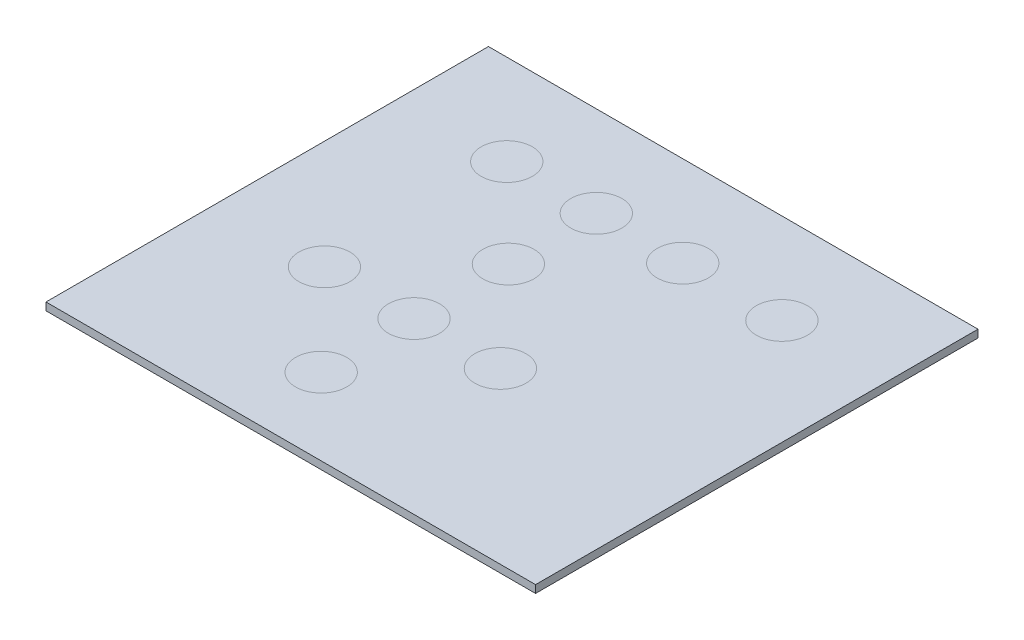
ISO-10303-21;
HEADER;
FILE_DESCRIPTION(('STEP AP214'),'2;1');
FILE_NAME('part.step','',(''),(''),'','','');
FILE_SCHEMA(('AUTOMOTIVE_DESIGN { 1 0 10303 214 1 1 1 1 }'));
ENDSEC;
DATA;
#1=APPLICATION_CONTEXT('core data for automotive mechanical design processes');
#2=APPLICATION_PROTOCOL_DEFINITION('international standard','automotive_design',2000,#1);
#3=PRODUCT_CONTEXT('',#1,'mechanical');
#4=PRODUCT('Part','Part','',(#3));
#5=PRODUCT_RELATED_PRODUCT_CATEGORY('part','',(#4));
#6=PRODUCT_DEFINITION_FORMATION('','',#4);
#7=PRODUCT_DEFINITION_CONTEXT('part definition',#1,'design');
#8=PRODUCT_DEFINITION('design','',#6,#7);
#9=PRODUCT_DEFINITION_SHAPE('','',#8);
#10=(LENGTH_UNIT() NAMED_UNIT(*) SI_UNIT(.MILLI.,.METRE.));
#11=(NAMED_UNIT(*) PLANE_ANGLE_UNIT() SI_UNIT($,.RADIAN.));
#12=(NAMED_UNIT(*) SI_UNIT($,.STERADIAN.) SOLID_ANGLE_UNIT());
#13=UNCERTAINTY_MEASURE_WITH_UNIT(LENGTH_MEASURE(1.E-05),#10,'distance_accuracy_value','');
#14=(GEOMETRIC_REPRESENTATION_CONTEXT(3) GLOBAL_UNCERTAINTY_ASSIGNED_CONTEXT((#13)) GLOBAL_UNIT_ASSIGNED_CONTEXT((#10,
#11,#12)) REPRESENTATION_CONTEXT('',''));
#15=CARTESIAN_POINT('',(0.,0.,0.));
#16=DIRECTION('',(0.,0.,1.));
#17=DIRECTION('',(1.,0.,0.));
#18=AXIS2_PLACEMENT_3D('',#15,#16,#17);
#19=CARTESIAN_POINT('',(0.,1.2,0.));
#20=DIRECTION('',(0.,-1.,0.));
#21=DIRECTION('',(0.,0.,-1.));
#22=AXIS2_PLACEMENT_3D('',#19,#20,#21);
#23=PLANE('',#22);
#24=DIRECTION('',(0.,0.,1.));
#25=VECTOR('',#24,1.);
#26=CARTESIAN_POINT('',(-38.25,1.2,-34.57));
#27=LINE('',#26,#25);
#28=CARTESIAN_POINT('',(-38.25,1.2,-34.57));
#29=VERTEX_POINT('',#28);
#30=CARTESIAN_POINT('',(-38.25,1.2,34.57));
#31=VERTEX_POINT('',#30);
#32=EDGE_CURVE('E94',#29,#31,#27,.T.);
#33=ORIENTED_EDGE('',*,*,#32,.T.);
#34=DIRECTION('',(1.,0.,0.));
#35=VECTOR('',#34,1.);
#36=CARTESIAN_POINT('',(38.25,1.2,34.57));
#37=LINE('',#36,#35);
#38=CARTESIAN_POINT('',(38.25,1.2,34.57));
#39=VERTEX_POINT('',#38);
#40=EDGE_CURVE('E89',#31,#39,#37,.T.);
#41=ORIENTED_EDGE('',*,*,#40,.T.);
#42=DIRECTION('',(0.,0.,-1.));
#43=VECTOR('',#42,1.);
#44=CARTESIAN_POINT('',(38.25,1.2,-34.57));
#45=LINE('',#44,#43);
#46=CARTESIAN_POINT('',(38.25,1.2,-34.57));
#47=VERTEX_POINT('',#46);
#48=EDGE_CURVE('E92',#39,#47,#45,.T.);
#49=ORIENTED_EDGE('',*,*,#48,.T.);
#50=DIRECTION('',(-1.,0.,0.));
#51=VECTOR('',#50,1.);
#52=CARTESIAN_POINT('',(38.25,1.2,-34.57));
#53=LINE('',#52,#51);
#54=EDGE_CURVE('E58',#47,#29,#53,.T.);
#55=ORIENTED_EDGE('',*,*,#54,.T.);
#56=EDGE_LOOP('',(#33,#41,#49,#55));
#57=FACE_BOUND('',#56,.T.);
#58=CARTESIAN_POINT('',(-21.25,1.2,8.06));
#59=DIRECTION('',(0.,-1.,0.));
#60=DIRECTION('',(0.,0.,-1.));
#61=AXIS2_PLACEMENT_3D('',#58,#59,#60);
#62=CIRCLE('',#61,4.);
#63=CARTESIAN_POINT('',(-21.25,1.2,4.06000000000001));
#64=VERTEX_POINT('',#63);
#65=EDGE_CURVE('E129',#64,#64,#62,.F.);
#66=ORIENTED_EDGE('',*,*,#65,.F.);
#67=EDGE_LOOP('',(#66));
#68=FACE_BOUND('',#67,.T.);
#69=CARTESIAN_POINT('',(-21.25,1.2,-20.43));
#70=DIRECTION('',(0.,-1.,0.));
#71=DIRECTION('',(0.,0.,-1.));
#72=AXIS2_PLACEMENT_3D('',#69,#70,#71);
#73=CIRCLE('',#72,4.);
#74=CARTESIAN_POINT('',(-21.25,1.2,-24.43));
#75=VERTEX_POINT('',#74);
#76=EDGE_CURVE('E133',#75,#75,#73,.F.);
#77=ORIENTED_EDGE('',*,*,#76,.F.);
#78=EDGE_LOOP('',(#77));
#79=FACE_BOUND('',#78,.T.);
#80=CARTESIAN_POINT('',(-7.24999999999999,1.2,-20.43));
#81=DIRECTION('',(0.,-1.,0.));
#82=DIRECTION('',(0.,0.,-1.));
#83=AXIS2_PLACEMENT_3D('',#80,#81,#82);
#84=CIRCLE('',#83,4.);
#85=CARTESIAN_POINT('',(-7.24999999999999,1.2,-24.43));
#86=VERTEX_POINT('',#85);
#87=EDGE_CURVE('E137',#86,#86,#84,.F.);
#88=ORIENTED_EDGE('',*,*,#87,.F.);
#89=EDGE_LOOP('',(#88));
#90=FACE_BOUND('',#89,.T.);
#91=CARTESIAN_POINT('',(6.25000000000001,1.2,-20.43));
#92=DIRECTION('',(0.,-1.,0.));
#93=DIRECTION('',(0.,0.,-1.));
#94=AXIS2_PLACEMENT_3D('',#91,#92,#93);
#95=CIRCLE('',#94,4.);
#96=CARTESIAN_POINT('',(6.25000000000001,1.2,-24.43));
#97=VERTEX_POINT('',#96);
#98=EDGE_CURVE('E141',#97,#97,#95,.F.);
#99=ORIENTED_EDGE('',*,*,#98,.F.);
#100=EDGE_LOOP('',(#99));
#101=FACE_BOUND('',#100,.T.);
#102=CARTESIAN_POINT('',(21.75,1.2,-20.43));
#103=DIRECTION('',(0.,-1.,0.));
#104=DIRECTION('',(0.,0.,-1.));
#105=AXIS2_PLACEMENT_3D('',#102,#103,#104);
#106=CIRCLE('',#105,4.);
#107=CARTESIAN_POINT('',(21.75,1.2,-24.43));
#108=VERTEX_POINT('',#107);
#109=EDGE_CURVE('E145',#108,#108,#106,.F.);
#110=ORIENTED_EDGE('',*,*,#109,.F.);
#111=EDGE_LOOP('',(#110));
#112=FACE_BOUND('',#111,.T.);
#113=CARTESIAN_POINT('',(6.25000000000001,1.2,8.06));
#114=DIRECTION('',(0.,-1.,0.));
#115=DIRECTION('',(0.,0.,-1.));
#116=AXIS2_PLACEMENT_3D('',#113,#114,#115);
#117=CIRCLE('',#116,4.);
#118=CARTESIAN_POINT('',(6.25000000000001,1.2,4.06));
#119=VERTEX_POINT('',#118);
#120=EDGE_CURVE('E149',#119,#119,#117,.F.);
#121=ORIENTED_EDGE('',*,*,#120,.F.);
#122=EDGE_LOOP('',(#121));
#123=FACE_BOUND('',#122,.T.);
#124=CARTESIAN_POINT('',(-7.24999999999999,1.2,8.06));
#125=DIRECTION('',(0.,-1.,0.));
#126=DIRECTION('',(0.,0.,-1.));
#127=AXIS2_PLACEMENT_3D('',#124,#125,#126);
#128=CIRCLE('',#127,4.);
#129=CARTESIAN_POINT('',(-7.24999999999999,1.2,4.06));
#130=VERTEX_POINT('',#129);
#131=EDGE_CURVE('E153',#130,#130,#128,.F.);
#132=ORIENTED_EDGE('',*,*,#131,.F.);
#133=EDGE_LOOP('',(#132));
#134=FACE_BOUND('',#133,.T.);
#135=CARTESIAN_POINT('',(-7.24999999999999,1.2,22.57));
#136=DIRECTION('',(0.,-1.,0.));
#137=DIRECTION('',(0.,0.,-1.));
#138=AXIS2_PLACEMENT_3D('',#135,#136,#137);
#139=CIRCLE('',#138,4.);
#140=CARTESIAN_POINT('',(-7.24999999999999,1.2,18.57));
#141=VERTEX_POINT('',#140);
#142=EDGE_CURVE('E50',#141,#141,#139,.F.);
#143=ORIENTED_EDGE('',*,*,#142,.F.);
#144=EDGE_LOOP('',(#143));
#145=FACE_BOUND('',#144,.T.);
#146=CARTESIAN_POINT('',(-7.24999999999999,1.2,-6.68999999999998));
#147=DIRECTION('',(0.,-1.,0.));
#148=DIRECTION('',(0.,0.,-1.));
#149=AXIS2_PLACEMENT_3D('',#146,#147,#148);
#150=CIRCLE('',#149,4.);
#151=CARTESIAN_POINT('',(-7.24999999999999,1.2,-10.69));
#152=VERTEX_POINT('',#151);
#153=EDGE_CURVE('E11',#152,#152,#150,.F.);
#154=ORIENTED_EDGE('',*,*,#153,.F.);
#155=EDGE_LOOP('',(#154));
#156=FACE_BOUND('',#155,.T.);
#157=ADVANCED_FACE('F40',(#57,#68,#79,#90,#101,#112,#123,#134,#145,#156),#23,.F.);
#158=ORIENTED_EDGE('',*,*,#153,.T.);
#159=EDGE_LOOP('',(#158));
#160=FACE_BOUND('',#159,.T.);
#161=ADVANCED_FACE('F165',(#160),#23,.F.);
#162=ORIENTED_EDGE('',*,*,#142,.T.);
#163=EDGE_LOOP('',(#162));
#164=FACE_BOUND('',#163,.T.);
#165=ADVANCED_FACE('F161',(#164),#23,.F.);
#166=ORIENTED_EDGE('',*,*,#131,.T.);
#167=EDGE_LOOP('',(#166));
#168=FACE_BOUND('',#167,.T.);
#169=ADVANCED_FACE('F174',(#168),#23,.F.);
#170=ORIENTED_EDGE('',*,*,#120,.T.);
#171=EDGE_LOOP('',(#170));
#172=FACE_BOUND('',#171,.T.);
#173=ADVANCED_FACE('F218',(#172),#23,.F.);
#174=ORIENTED_EDGE('',*,*,#109,.T.);
#175=EDGE_LOOP('',(#174));
#176=FACE_BOUND('',#175,.T.);
#177=ADVANCED_FACE('F222',(#176),#23,.F.);
#178=ORIENTED_EDGE('',*,*,#98,.T.);
#179=EDGE_LOOP('',(#178));
#180=FACE_BOUND('',#179,.T.);
#181=ADVANCED_FACE('F202',(#180),#23,.F.);
#182=ORIENTED_EDGE('',*,*,#87,.T.);
#183=EDGE_LOOP('',(#182));
#184=FACE_BOUND('',#183,.T.);
#185=ADVANCED_FACE('F195',(#184),#23,.F.);
#186=ORIENTED_EDGE('',*,*,#76,.T.);
#187=EDGE_LOOP('',(#186));
#188=FACE_BOUND('',#187,.T.);
#189=ADVANCED_FACE('F180',(#188),#23,.F.);
#190=CARTESIAN_POINT('',(-38.25,1.2,-34.57));
#191=DIRECTION('',(1.,0.,0.));
#192=DIRECTION('',(0.,0.,-1.));
#193=AXIS2_PLACEMENT_3D('',#190,#191,#192);
#194=PLANE('',#193);
#195=DIRECTION('',(0.,0.,1.));
#196=VECTOR('',#195,1.);
#197=CARTESIAN_POINT('',(-38.25,0.,-34.57));
#198=LINE('',#197,#196);
#199=CARTESIAN_POINT('',(-38.25,0.,-34.57));
#200=VERTEX_POINT('',#199);
#201=CARTESIAN_POINT('',(-38.25,0.,34.57));
#202=VERTEX_POINT('',#201);
#203=EDGE_CURVE('E113',#200,#202,#198,.T.);
#204=ORIENTED_EDGE('',*,*,#203,.T.);
#205=DIRECTION('',(0.,-1.,0.));
#206=VECTOR('',#205,1.);
#207=CARTESIAN_POINT('',(-38.25,1.2,34.57));
#208=LINE('',#207,#206);
#209=EDGE_CURVE('E102',#31,#202,#208,.T.);
#210=ORIENTED_EDGE('',*,*,#209,.F.);
#211=ORIENTED_EDGE('',*,*,#32,.F.);
#212=DIRECTION('',(0.,-1.,0.));
#213=VECTOR('',#212,1.);
#214=CARTESIAN_POINT('',(-38.25,1.2,-34.57));
#215=LINE('',#214,#213);
#216=EDGE_CURVE('E109',#29,#200,#215,.T.);
#217=ORIENTED_EDGE('',*,*,#216,.T.);
#218=EDGE_LOOP('',(#204,#210,#211,#217));
#219=FACE_BOUND('',#218,.T.);
#220=ADVANCED_FACE('F42',(#219),#194,.F.);
#221=CARTESIAN_POINT('',(38.25,1.2,34.57));
#222=DIRECTION('',(0.,0.,-1.));
#223=DIRECTION('',(-1.,0.,0.));
#224=AXIS2_PLACEMENT_3D('',#221,#222,#223);
#225=PLANE('',#224);
#226=DIRECTION('',(1.,0.,0.));
#227=VECTOR('',#226,1.);
#228=CARTESIAN_POINT('',(38.25,0.,34.57));
#229=LINE('',#228,#227);
#230=CARTESIAN_POINT('',(38.25,0.,34.57));
#231=VERTEX_POINT('',#230);
#232=EDGE_CURVE('E100',#202,#231,#229,.T.);
#233=ORIENTED_EDGE('',*,*,#232,.T.);
#234=DIRECTION('',(0.,-1.,0.));
#235=VECTOR('',#234,1.);
#236=CARTESIAN_POINT('',(38.25,1.2,34.57));
#237=LINE('',#236,#235);
#238=EDGE_CURVE('E98',#39,#231,#237,.T.);
#239=ORIENTED_EDGE('',*,*,#238,.F.);
#240=ORIENTED_EDGE('',*,*,#40,.F.);
#241=ORIENTED_EDGE('',*,*,#209,.T.);
#242=EDGE_LOOP('',(#233,#239,#240,#241));
#243=FACE_BOUND('',#242,.T.);
#244=ADVANCED_FACE('F99',(#243),#225,.F.);
#245=CARTESIAN_POINT('',(38.25,1.2,-34.57));
#246=DIRECTION('',(-1.,0.,0.));
#247=DIRECTION('',(0.,0.,1.));
#248=AXIS2_PLACEMENT_3D('',#245,#246,#247);
#249=PLANE('',#248);
#250=DIRECTION('',(0.,0.,-1.));
#251=VECTOR('',#250,1.);
#252=CARTESIAN_POINT('',(38.25,0.,-34.57));
#253=LINE('',#252,#251);
#254=CARTESIAN_POINT('',(38.25,0.,-34.57));
#255=VERTEX_POINT('',#254);
#256=EDGE_CURVE('E75',#231,#255,#253,.T.);
#257=ORIENTED_EDGE('',*,*,#256,.T.);
#258=DIRECTION('',(0.,-1.,0.));
#259=VECTOR('',#258,1.);
#260=CARTESIAN_POINT('',(38.25,1.2,-34.57));
#261=LINE('',#260,#259);
#262=EDGE_CURVE('E103',#47,#255,#261,.T.);
#263=ORIENTED_EDGE('',*,*,#262,.F.);
#264=ORIENTED_EDGE('',*,*,#48,.F.);
#265=ORIENTED_EDGE('',*,*,#238,.T.);
#266=EDGE_LOOP('',(#257,#263,#264,#265));
#267=FACE_BOUND('',#266,.T.);
#268=ADVANCED_FACE('F105',(#267),#249,.F.);
#269=CARTESIAN_POINT('',(38.25,1.2,-34.57));
#270=DIRECTION('',(0.,0.,1.));
#271=DIRECTION('',(1.,0.,0.));
#272=AXIS2_PLACEMENT_3D('',#269,#270,#271);
#273=PLANE('',#272);
#274=DIRECTION('',(-1.,0.,0.));
#275=VECTOR('',#274,1.);
#276=CARTESIAN_POINT('',(38.25,0.,-34.57));
#277=LINE('',#276,#275);
#278=EDGE_CURVE('E81',#255,#200,#277,.T.);
#279=ORIENTED_EDGE('',*,*,#278,.T.);
#280=ORIENTED_EDGE('',*,*,#216,.F.);
#281=ORIENTED_EDGE('',*,*,#54,.F.);
#282=ORIENTED_EDGE('',*,*,#262,.T.);
#283=EDGE_LOOP('',(#279,#280,#281,#282));
#284=FACE_BOUND('',#283,.T.);
#285=ADVANCED_FACE('F178',(#284),#273,.F.);
#286=ORIENTED_EDGE('',*,*,#65,.T.);
#287=EDGE_LOOP('',(#286));
#288=FACE_BOUND('',#287,.T.);
#289=ADVANCED_FACE('F167',(#288),#23,.F.);
#290=CARTESIAN_POINT('',(0.,0.,0.));
#291=DIRECTION('',(0.,-1.,0.));
#292=DIRECTION('',(0.,0.,-1.));
#293=AXIS2_PLACEMENT_3D('',#290,#291,#292);
#294=PLANE('',#293);
#295=ORIENTED_EDGE('',*,*,#203,.F.);
#296=ORIENTED_EDGE('',*,*,#278,.F.);
#297=ORIENTED_EDGE('',*,*,#256,.F.);
#298=ORIENTED_EDGE('',*,*,#232,.F.);
#299=EDGE_LOOP('',(#295,#296,#297,#298));
#300=FACE_BOUND('',#299,.T.);
#301=ADVANCED_FACE('F177',(#300),#294,.T.);
#302=CLOSED_SHELL('',(#157,#161,#165,#169,#173,#177,#181,#185,#189,#220,#244,#268,#285,#289,#301));
#303=MANIFOLD_SOLID_BREP('B2',#302);
#304=ADVANCED_BREP_SHAPE_REPRESENTATION('',(#18,#303),#14);
#305=SHAPE_DEFINITION_REPRESENTATION(#9,#304);
ENDSEC;
END-ISO-10303-21;
